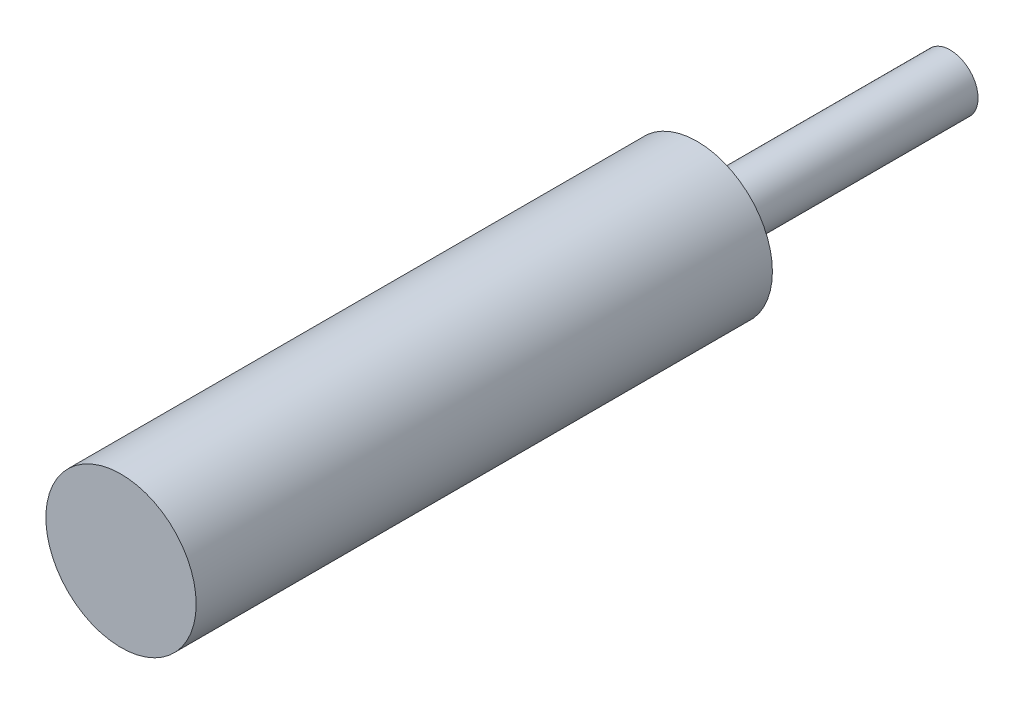
ISO-10303-21;
HEADER;
FILE_DESCRIPTION(('STEP AP214'),'2;1');
FILE_NAME('part.step','',(''),(''),'','','');
FILE_SCHEMA(('AUTOMOTIVE_DESIGN { 1 0 10303 214 1 1 1 1 }'));
ENDSEC;
DATA;
#1=APPLICATION_CONTEXT('core data for automotive mechanical design processes');
#2=APPLICATION_PROTOCOL_DEFINITION('international standard','automotive_design',2000,#1);
#3=PRODUCT_CONTEXT('',#1,'mechanical');
#4=PRODUCT('Part','Part','',(#3));
#5=PRODUCT_RELATED_PRODUCT_CATEGORY('part','',(#4));
#6=PRODUCT_DEFINITION_FORMATION('','',#4);
#7=PRODUCT_DEFINITION_CONTEXT('part definition',#1,'design');
#8=PRODUCT_DEFINITION('design','',#6,#7);
#9=PRODUCT_DEFINITION_SHAPE('','',#8);
#10=(LENGTH_UNIT() NAMED_UNIT(*) SI_UNIT(.MILLI.,.METRE.));
#11=(NAMED_UNIT(*) PLANE_ANGLE_UNIT() SI_UNIT($,.RADIAN.));
#12=(NAMED_UNIT(*) SI_UNIT($,.STERADIAN.) SOLID_ANGLE_UNIT());
#13=UNCERTAINTY_MEASURE_WITH_UNIT(LENGTH_MEASURE(1.E-05),#10,'distance_accuracy_value','');
#14=(GEOMETRIC_REPRESENTATION_CONTEXT(3) GLOBAL_UNCERTAINTY_ASSIGNED_CONTEXT((#13)) GLOBAL_UNIT_ASSIGNED_CONTEXT((#10,
#11,#12)) REPRESENTATION_CONTEXT('',''));
#15=CARTESIAN_POINT('',(0.,0.,0.));
#16=DIRECTION('',(0.,0.,1.));
#17=DIRECTION('',(1.,0.,0.));
#18=AXIS2_PLACEMENT_3D('',#15,#16,#17);
#19=CARTESIAN_POINT('',(0.,0.,-25.65));
#20=DIRECTION('',(0.,0.,1.));
#21=DIRECTION('',(1.,0.,0.));
#22=AXIS2_PLACEMENT_3D('',#19,#20,#21);
#23=CYLINDRICAL_SURFACE('',#22,2.325);
#24=CARTESIAN_POINT('',(0.,0.,0.));
#25=DIRECTION('',(0.,0.,1.));
#26=DIRECTION('',(1.,0.,0.));
#27=AXIS2_PLACEMENT_3D('',#24,#25,#26);
#28=CIRCLE('',#27,2.325);
#29=CARTESIAN_POINT('',(2.325,0.,0.));
#30=VERTEX_POINT('',#29);
#31=EDGE_CURVE('E10',#30,#30,#28,.T.);
#32=ORIENTED_EDGE('',*,*,#31,.F.);
#33=EDGE_LOOP('',(#32));
#34=FACE_BOUND('',#33,.T.);
#35=CARTESIAN_POINT('',(0.,0.,-17.825));
#36=DIRECTION('',(0.,0.,-1.));
#37=DIRECTION('',(-1.,0.,0.));
#38=AXIS2_PLACEMENT_3D('',#35,#36,#37);
#39=CIRCLE('',#38,2.325);
#40=CARTESIAN_POINT('',(-2.325,0.,-17.825));
#41=VERTEX_POINT('',#40);
#42=EDGE_CURVE('E37',#41,#41,#39,.T.);
#43=ORIENTED_EDGE('',*,*,#42,.F.);
#44=EDGE_LOOP('',(#43));
#45=FACE_BOUND('',#44,.T.);
#46=ADVANCED_FACE('F31',(#34,#45),#23,.T.);
#47=CARTESIAN_POINT('',(0.,0.,0.));
#48=DIRECTION('',(0.,0.,1.));
#49=DIRECTION('',(1.,0.,0.));
#50=AXIS2_PLACEMENT_3D('',#47,#48,#49);
#51=PLANE('',#50);
#52=ORIENTED_EDGE('',*,*,#31,.T.);
#53=EDGE_LOOP('',(#52));
#54=FACE_BOUND('',#53,.T.);
#55=ADVANCED_FACE('F63',(#54),#51,.T.);
#56=CARTESIAN_POINT('',(0.,0.,-17.825));
#57=DIRECTION('',(0.,0.,-1.));
#58=DIRECTION('',(-1.,0.,0.));
#59=AXIS2_PLACEMENT_3D('',#56,#57,#58);
#60=PLANE('',#59);
#61=CARTESIAN_POINT('',(0.,0.,-17.825));
#62=DIRECTION('',(0.,0.,-1.));
#63=DIRECTION('',(-1.,0.,0.));
#64=AXIS2_PLACEMENT_3D('',#61,#62,#63);
#65=CIRCLE('',#64,0.861848990135781);
#66=CARTESIAN_POINT('',(-0.861848990135781,0.,-17.825));
#67=VERTEX_POINT('',#66);
#68=EDGE_CURVE('E41',#67,#67,#65,.T.);
#69=ORIENTED_EDGE('',*,*,#68,.F.);
#70=EDGE_LOOP('',(#69));
#71=FACE_BOUND('',#70,.T.);
#72=ORIENTED_EDGE('',*,*,#42,.T.);
#73=EDGE_LOOP('',(#72));
#74=FACE_BOUND('',#73,.T.);
#75=ADVANCED_FACE('F55',(#71,#74),#60,.T.);
#76=CARTESIAN_POINT('',(0.,0.,-17.825));
#77=DIRECTION('',(0.,0.,-1.));
#78=DIRECTION('',(-1.,0.,0.));
#79=AXIS2_PLACEMENT_3D('',#76,#77,#78);
#80=CYLINDRICAL_SURFACE('',#79,0.861848990135781);
#81=ORIENTED_EDGE('',*,*,#68,.T.);
#82=EDGE_LOOP('',(#81));
#83=FACE_BOUND('',#82,.T.);
#84=CARTESIAN_POINT('',(0.,0.,-25.65));
#85=DIRECTION('',(0.,0.,-1.));
#86=DIRECTION('',(-1.,0.,0.));
#87=AXIS2_PLACEMENT_3D('',#84,#85,#86);
#88=CIRCLE('',#87,0.861848990135781);
#89=CARTESIAN_POINT('',(-0.861848990135781,0.,-25.65));
#90=VERTEX_POINT('',#89);
#91=EDGE_CURVE('E45',#90,#90,#88,.T.);
#92=ORIENTED_EDGE('',*,*,#91,.F.);
#93=EDGE_LOOP('',(#92));
#94=FACE_BOUND('',#93,.T.);
#95=ADVANCED_FACE('F53',(#83,#94),#80,.T.);
#96=CARTESIAN_POINT('',(0.,0.,-25.65));
#97=DIRECTION('',(0.,0.,1.));
#98=DIRECTION('',(1.,0.,0.));
#99=AXIS2_PLACEMENT_3D('',#96,#97,#98);
#100=PLANE('',#99);
#101=ORIENTED_EDGE('',*,*,#91,.T.);
#102=EDGE_LOOP('',(#101));
#103=FACE_BOUND('',#102,.T.);
#104=ADVANCED_FACE('F51',(#103),#100,.F.);
#105=CLOSED_SHELL('',(#46,#55,#75,#95,#104));
#106=MANIFOLD_SOLID_BREP('B2',#105);
#107=ADVANCED_BREP_SHAPE_REPRESENTATION('',(#18,#106),#14);
#108=SHAPE_DEFINITION_REPRESENTATION(#9,#107);
ENDSEC;
END-ISO-10303-21;
